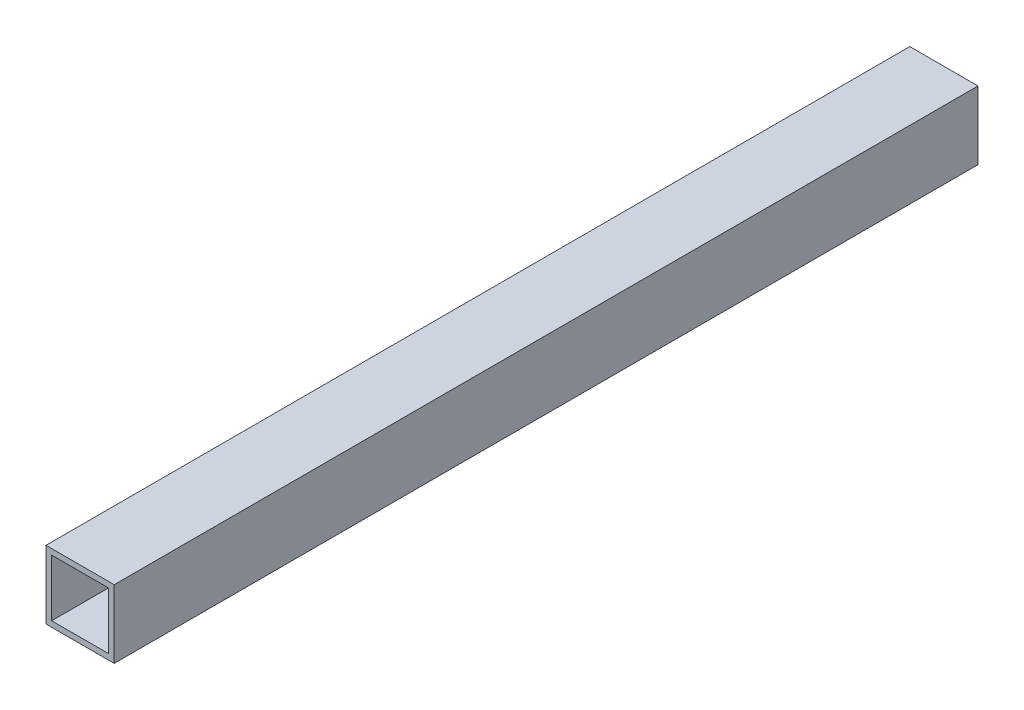
ISO-10303-21;
HEADER;
FILE_DESCRIPTION(('STEP AP214'),'2;1');
FILE_NAME('part.step','',(''),(''),'','','');
FILE_SCHEMA(('AUTOMOTIVE_DESIGN { 1 0 10303 214 1 1 1 1 }'));
ENDSEC;
DATA;
#1=APPLICATION_CONTEXT('core data for automotive mechanical design processes');
#2=APPLICATION_PROTOCOL_DEFINITION('international standard','automotive_design',2000,#1);
#3=PRODUCT_CONTEXT('',#1,'mechanical');
#4=PRODUCT('Part','Part','',(#3));
#5=PRODUCT_RELATED_PRODUCT_CATEGORY('part','',(#4));
#6=PRODUCT_DEFINITION_FORMATION('','',#4);
#7=PRODUCT_DEFINITION_CONTEXT('part definition',#1,'design');
#8=PRODUCT_DEFINITION('design','',#6,#7);
#9=PRODUCT_DEFINITION_SHAPE('','',#8);
#10=(LENGTH_UNIT() NAMED_UNIT(*) SI_UNIT(.MILLI.,.METRE.));
#11=(NAMED_UNIT(*) PLANE_ANGLE_UNIT() SI_UNIT($,.RADIAN.));
#12=(NAMED_UNIT(*) SI_UNIT($,.STERADIAN.) SOLID_ANGLE_UNIT());
#13=UNCERTAINTY_MEASURE_WITH_UNIT(LENGTH_MEASURE(1.E-05),#10,'distance_accuracy_value','');
#14=(GEOMETRIC_REPRESENTATION_CONTEXT(3) GLOBAL_UNCERTAINTY_ASSIGNED_CONTEXT((#13)) GLOBAL_UNIT_ASSIGNED_CONTEXT((#10,
#11,#12)) REPRESENTATION_CONTEXT('',''));
#15=CARTESIAN_POINT('',(0.,0.,0.));
#16=DIRECTION('',(0.,0.,1.));
#17=DIRECTION('',(1.,0.,0.));
#18=AXIS2_PLACEMENT_3D('',#15,#16,#17);
#19=CARTESIAN_POINT('',(0.,0.,241.3));
#20=DIRECTION('',(0.,0.,1.));
#21=DIRECTION('',(1.,0.,0.));
#22=AXIS2_PLACEMENT_3D('',#19,#20,#21);
#23=PLANE('',#22);
#24=DIRECTION('',(0.,-1.,0.));
#25=VECTOR('',#24,1.);
#26=CARTESIAN_POINT('',(-19.05,-19.05,241.3));
#27=LINE('',#26,#25);
#28=CARTESIAN_POINT('',(-19.05,19.05,241.3));
#29=VERTEX_POINT('',#28);
#30=CARTESIAN_POINT('',(-19.05,-19.05,241.3));
#31=VERTEX_POINT('',#30);
#32=EDGE_CURVE('E117',#29,#31,#27,.T.);
#33=ORIENTED_EDGE('',*,*,#32,.T.);
#34=DIRECTION('',(1.,0.,0.));
#35=VECTOR('',#34,1.);
#36=CARTESIAN_POINT('',(19.05,-19.05,241.3));
#37=LINE('',#36,#35);
#38=CARTESIAN_POINT('',(19.05,-19.05,241.3));
#39=VERTEX_POINT('',#38);
#40=EDGE_CURVE('E176',#31,#39,#37,.T.);
#41=ORIENTED_EDGE('',*,*,#40,.T.);
#42=DIRECTION('',(0.,1.,0.));
#43=VECTOR('',#42,1.);
#44=CARTESIAN_POINT('',(19.05,-19.05,241.3));
#45=LINE('',#44,#43);
#46=CARTESIAN_POINT('',(19.05,19.05,241.3));
#47=VERTEX_POINT('',#46);
#48=EDGE_CURVE('E179',#39,#47,#45,.T.);
#49=ORIENTED_EDGE('',*,*,#48,.T.);
#50=DIRECTION('',(-1.,0.,0.));
#51=VECTOR('',#50,1.);
#52=CARTESIAN_POINT('',(19.05,19.05,241.3));
#53=LINE('',#52,#51);
#54=EDGE_CURVE('E63',#47,#29,#53,.T.);
#55=ORIENTED_EDGE('',*,*,#54,.T.);
#56=EDGE_LOOP('',(#33,#41,#49,#55));
#57=FACE_BOUND('',#56,.T.);
#58=DIRECTION('',(1.,0.,0.));
#59=VECTOR('',#58,1.);
#60=CARTESIAN_POINT('',(15.875,-15.875,241.3));
#61=LINE('',#60,#59);
#62=CARTESIAN_POINT('',(-15.875,-15.875,241.3));
#63=VERTEX_POINT('',#62);
#64=CARTESIAN_POINT('',(15.875,-15.875,241.3));
#65=VERTEX_POINT('',#64);
#66=EDGE_CURVE('E158',#63,#65,#61,.T.);
#67=ORIENTED_EDGE('',*,*,#66,.F.);
#68=DIRECTION('',(0.,-1.,0.));
#69=VECTOR('',#68,1.);
#70=CARTESIAN_POINT('',(-15.875,-15.875,241.3));
#71=LINE('',#70,#69);
#72=CARTESIAN_POINT('',(-15.875,15.875,241.3));
#73=VERTEX_POINT('',#72);
#74=EDGE_CURVE('E113',#73,#63,#71,.T.);
#75=ORIENTED_EDGE('',*,*,#74,.F.);
#76=DIRECTION('',(-1.,0.,0.));
#77=VECTOR('',#76,1.);
#78=CARTESIAN_POINT('',(15.875,15.875,241.3));
#79=LINE('',#78,#77);
#80=CARTESIAN_POINT('',(15.875,15.875,241.3));
#81=VERTEX_POINT('',#80);
#82=EDGE_CURVE('E164',#81,#73,#79,.T.);
#83=ORIENTED_EDGE('',*,*,#82,.F.);
#84=DIRECTION('',(0.,1.,0.));
#85=VECTOR('',#84,1.);
#86=CARTESIAN_POINT('',(15.875,-15.875,241.3));
#87=LINE('',#86,#85);
#88=EDGE_CURVE('E161',#65,#81,#87,.T.);
#89=ORIENTED_EDGE('',*,*,#88,.F.);
#90=EDGE_LOOP('',(#67,#75,#83,#89));
#91=FACE_BOUND('',#90,.T.);
#92=ADVANCED_FACE('F39',(#57,#91),#23,.T.);
#93=CARTESIAN_POINT('',(-19.05,-19.05,241.3));
#94=DIRECTION('',(1.,0.,0.));
#95=DIRECTION('',(0.,0.,-1.));
#96=AXIS2_PLACEMENT_3D('',#93,#94,#95);
#97=PLANE('',#96);
#98=DIRECTION('',(0.,0.,-1.));
#99=VECTOR('',#98,1.);
#100=CARTESIAN_POINT('',(-19.05,19.05,241.3));
#101=LINE('',#100,#99);
#102=CARTESIAN_POINT('',(-19.05,19.05,-241.3));
#103=VERTEX_POINT('',#102);
#104=EDGE_CURVE('E184',#29,#103,#101,.T.);
#105=ORIENTED_EDGE('',*,*,#104,.T.);
#106=DIRECTION('',(0.,-1.,0.));
#107=VECTOR('',#106,1.);
#108=CARTESIAN_POINT('',(-19.05,-19.05,-241.3));
#109=LINE('',#108,#107);
#110=CARTESIAN_POINT('',(-19.05,-19.05,-241.3));
#111=VERTEX_POINT('',#110);
#112=EDGE_CURVE('E140',#103,#111,#109,.T.);
#113=ORIENTED_EDGE('',*,*,#112,.T.);
#114=DIRECTION('',(0.,0.,-1.));
#115=VECTOR('',#114,1.);
#116=CARTESIAN_POINT('',(-19.05,-19.05,241.3));
#117=LINE('',#116,#115);
#118=EDGE_CURVE('E11',#31,#111,#117,.T.);
#119=ORIENTED_EDGE('',*,*,#118,.F.);
#120=ORIENTED_EDGE('',*,*,#32,.F.);
#121=EDGE_LOOP('',(#105,#113,#119,#120));
#122=FACE_BOUND('',#121,.T.);
#123=ADVANCED_FACE('F41',(#122),#97,.F.);
#124=CARTESIAN_POINT('',(19.05,-19.05,241.3));
#125=DIRECTION('',(0.,1.,0.));
#126=DIRECTION('',(0.,0.,1.));
#127=AXIS2_PLACEMENT_3D('',#124,#125,#126);
#128=PLANE('',#127);
#129=ORIENTED_EDGE('',*,*,#118,.T.);
#130=DIRECTION('',(1.,0.,0.));
#131=VECTOR('',#130,1.);
#132=CARTESIAN_POINT('',(19.05,-19.05,-241.3));
#133=LINE('',#132,#131);
#134=CARTESIAN_POINT('',(19.05,-19.05,-241.3));
#135=VERTEX_POINT('',#134);
#136=EDGE_CURVE('E144',#111,#135,#133,.T.);
#137=ORIENTED_EDGE('',*,*,#136,.T.);
#138=DIRECTION('',(0.,0.,-1.));
#139=VECTOR('',#138,1.);
#140=CARTESIAN_POINT('',(19.05,-19.05,241.3));
#141=LINE('',#140,#139);
#142=EDGE_CURVE('E48',#39,#135,#141,.T.);
#143=ORIENTED_EDGE('',*,*,#142,.F.);
#144=ORIENTED_EDGE('',*,*,#40,.F.);
#145=EDGE_LOOP('',(#129,#137,#143,#144));
#146=FACE_BOUND('',#145,.T.);
#147=ADVANCED_FACE('F200',(#146),#128,.F.);
#148=CARTESIAN_POINT('',(19.05,-19.05,241.3));
#149=DIRECTION('',(-1.,0.,0.));
#150=DIRECTION('',(0.,0.,1.));
#151=AXIS2_PLACEMENT_3D('',#148,#149,#150);
#152=PLANE('',#151);
#153=ORIENTED_EDGE('',*,*,#142,.T.);
#154=DIRECTION('',(0.,1.,0.));
#155=VECTOR('',#154,1.);
#156=CARTESIAN_POINT('',(19.05,-19.05,-241.3));
#157=LINE('',#156,#155);
#158=CARTESIAN_POINT('',(19.05,19.05,-241.3));
#159=VERTEX_POINT('',#158);
#160=EDGE_CURVE('E148',#135,#159,#157,.T.);
#161=ORIENTED_EDGE('',*,*,#160,.T.);
#162=DIRECTION('',(0.,0.,-1.));
#163=VECTOR('',#162,1.);
#164=CARTESIAN_POINT('',(19.05,19.05,241.3));
#165=LINE('',#164,#163);
#166=EDGE_CURVE('E187',#47,#159,#165,.T.);
#167=ORIENTED_EDGE('',*,*,#166,.F.);
#168=ORIENTED_EDGE('',*,*,#48,.F.);
#169=EDGE_LOOP('',(#153,#161,#167,#168));
#170=FACE_BOUND('',#169,.T.);
#171=ADVANCED_FACE('F194',(#170),#152,.F.);
#172=CARTESIAN_POINT('',(19.05,19.05,241.3));
#173=DIRECTION('',(0.,-1.,0.));
#174=DIRECTION('',(0.,0.,-1.));
#175=AXIS2_PLACEMENT_3D('',#172,#173,#174);
#176=PLANE('',#175);
#177=ORIENTED_EDGE('',*,*,#166,.T.);
#178=DIRECTION('',(-1.,0.,0.));
#179=VECTOR('',#178,1.);
#180=CARTESIAN_POINT('',(19.05,19.05,-241.3));
#181=LINE('',#180,#179);
#182=EDGE_CURVE('E152',#159,#103,#181,.T.);
#183=ORIENTED_EDGE('',*,*,#182,.T.);
#184=ORIENTED_EDGE('',*,*,#104,.F.);
#185=ORIENTED_EDGE('',*,*,#54,.F.);
#186=EDGE_LOOP('',(#177,#183,#184,#185));
#187=FACE_BOUND('',#186,.T.);
#188=ADVANCED_FACE('F205',(#187),#176,.F.);
#189=CARTESIAN_POINT('',(-15.875,-15.875,241.3));
#190=DIRECTION('',(1.,0.,0.));
#191=DIRECTION('',(0.,1.,0.));
#192=AXIS2_PLACEMENT_3D('',#189,#190,#191);
#193=PLANE('',#192);
#194=DIRECTION('',(0.,0.,-1.));
#195=VECTOR('',#194,1.);
#196=CARTESIAN_POINT('',(-15.875,-15.875,241.3));
#197=LINE('',#196,#195);
#198=CARTESIAN_POINT('',(-15.875,-15.875,-241.3));
#199=VERTEX_POINT('',#198);
#200=EDGE_CURVE('E105',#63,#199,#197,.T.);
#201=ORIENTED_EDGE('',*,*,#200,.T.);
#202=DIRECTION('',(0.,-1.,0.));
#203=VECTOR('',#202,1.);
#204=CARTESIAN_POINT('',(-15.875,-15.875,-241.3));
#205=LINE('',#204,#203);
#206=CARTESIAN_POINT('',(-15.875,15.875,-241.3));
#207=VERTEX_POINT('',#206);
#208=EDGE_CURVE('E110',#207,#199,#205,.T.);
#209=ORIENTED_EDGE('',*,*,#208,.F.);
#210=DIRECTION('',(0.,0.,-1.));
#211=VECTOR('',#210,1.);
#212=CARTESIAN_POINT('',(-15.875,15.875,241.3));
#213=LINE('',#212,#211);
#214=EDGE_CURVE('E167',#73,#207,#213,.T.);
#215=ORIENTED_EDGE('',*,*,#214,.F.);
#216=ORIENTED_EDGE('',*,*,#74,.T.);
#217=EDGE_LOOP('',(#201,#209,#215,#216));
#218=FACE_BOUND('',#217,.T.);
#219=ADVANCED_FACE('F107',(#218),#193,.T.);
#220=CARTESIAN_POINT('',(15.875,-15.875,241.3));
#221=DIRECTION('',(0.,1.,0.));
#222=DIRECTION('',(0.,0.,1.));
#223=AXIS2_PLACEMENT_3D('',#220,#221,#222);
#224=PLANE('',#223);
#225=DIRECTION('',(0.,0.,-1.));
#226=VECTOR('',#225,1.);
#227=CARTESIAN_POINT('',(15.875,-15.875,241.3));
#228=LINE('',#227,#226);
#229=CARTESIAN_POINT('',(15.875,-15.875,-241.3));
#230=VERTEX_POINT('',#229);
#231=EDGE_CURVE('E118',#65,#230,#228,.T.);
#232=ORIENTED_EDGE('',*,*,#231,.T.);
#233=DIRECTION('',(1.,0.,0.));
#234=VECTOR('',#233,1.);
#235=CARTESIAN_POINT('',(15.875,-15.875,-241.3));
#236=LINE('',#235,#234);
#237=EDGE_CURVE('E121',#199,#230,#236,.T.);
#238=ORIENTED_EDGE('',*,*,#237,.F.);
#239=ORIENTED_EDGE('',*,*,#200,.F.);
#240=ORIENTED_EDGE('',*,*,#66,.T.);
#241=EDGE_LOOP('',(#232,#238,#239,#240));
#242=FACE_BOUND('',#241,.T.);
#243=ADVANCED_FACE('F122',(#242),#224,.T.);
#244=CARTESIAN_POINT('',(15.875,-15.875,241.3));
#245=DIRECTION('',(-1.,0.,0.));
#246=DIRECTION('',(0.,0.,1.));
#247=AXIS2_PLACEMENT_3D('',#244,#245,#246);
#248=PLANE('',#247);
#249=DIRECTION('',(0.,0.,-1.));
#250=VECTOR('',#249,1.);
#251=CARTESIAN_POINT('',(15.875,15.875,241.3));
#252=LINE('',#251,#250);
#253=CARTESIAN_POINT('',(15.875,15.875,-241.3));
#254=VERTEX_POINT('',#253);
#255=EDGE_CURVE('E55',#81,#254,#252,.T.);
#256=ORIENTED_EDGE('',*,*,#255,.T.);
#257=DIRECTION('',(0.,1.,0.));
#258=VECTOR('',#257,1.);
#259=CARTESIAN_POINT('',(15.875,-15.875,-241.3));
#260=LINE('',#259,#258);
#261=EDGE_CURVE('E128',#230,#254,#260,.T.);
#262=ORIENTED_EDGE('',*,*,#261,.F.);
#263=ORIENTED_EDGE('',*,*,#231,.F.);
#264=ORIENTED_EDGE('',*,*,#88,.T.);
#265=EDGE_LOOP('',(#256,#262,#263,#264));
#266=FACE_BOUND('',#265,.T.);
#267=ADVANCED_FACE('F223',(#266),#248,.T.);
#268=CARTESIAN_POINT('',(15.875,15.875,241.3));
#269=DIRECTION('',(0.,-1.,0.));
#270=DIRECTION('',(0.,0.,-1.));
#271=AXIS2_PLACEMENT_3D('',#268,#269,#270);
#272=PLANE('',#271);
#273=ORIENTED_EDGE('',*,*,#214,.T.);
#274=DIRECTION('',(-1.,0.,0.));
#275=VECTOR('',#274,1.);
#276=CARTESIAN_POINT('',(15.875,15.875,-241.3));
#277=LINE('',#276,#275);
#278=EDGE_CURVE('E132',#254,#207,#277,.T.);
#279=ORIENTED_EDGE('',*,*,#278,.F.);
#280=ORIENTED_EDGE('',*,*,#255,.F.);
#281=ORIENTED_EDGE('',*,*,#82,.T.);
#282=EDGE_LOOP('',(#273,#279,#280,#281));
#283=FACE_BOUND('',#282,.T.);
#284=ADVANCED_FACE('F226',(#283),#272,.T.);
#285=CARTESIAN_POINT('',(0.,0.,-241.3));
#286=DIRECTION('',(0.,0.,1.));
#287=DIRECTION('',(1.,0.,0.));
#288=AXIS2_PLACEMENT_3D('',#285,#286,#287);
#289=PLANE('',#288);
#290=ORIENTED_EDGE('',*,*,#278,.T.);
#291=ORIENTED_EDGE('',*,*,#208,.T.);
#292=ORIENTED_EDGE('',*,*,#237,.T.);
#293=ORIENTED_EDGE('',*,*,#261,.T.);
#294=EDGE_LOOP('',(#290,#291,#292,#293));
#295=FACE_BOUND('',#294,.T.);
#296=ORIENTED_EDGE('',*,*,#112,.F.);
#297=ORIENTED_EDGE('',*,*,#182,.F.);
#298=ORIENTED_EDGE('',*,*,#160,.F.);
#299=ORIENTED_EDGE('',*,*,#136,.F.);
#300=EDGE_LOOP('',(#296,#297,#298,#299));
#301=FACE_BOUND('',#300,.T.);
#302=ADVANCED_FACE('F130',(#295,#301),#289,.F.);
#303=CLOSED_SHELL('',(#92,#123,#147,#171,#188,#219,#243,#267,#284,#302));
#304=MANIFOLD_SOLID_BREP('B2',#303);
#305=ADVANCED_BREP_SHAPE_REPRESENTATION('',(#18,#304),#14);
#306=SHAPE_DEFINITION_REPRESENTATION(#9,#305);
ENDSEC;
END-ISO-10303-21;
